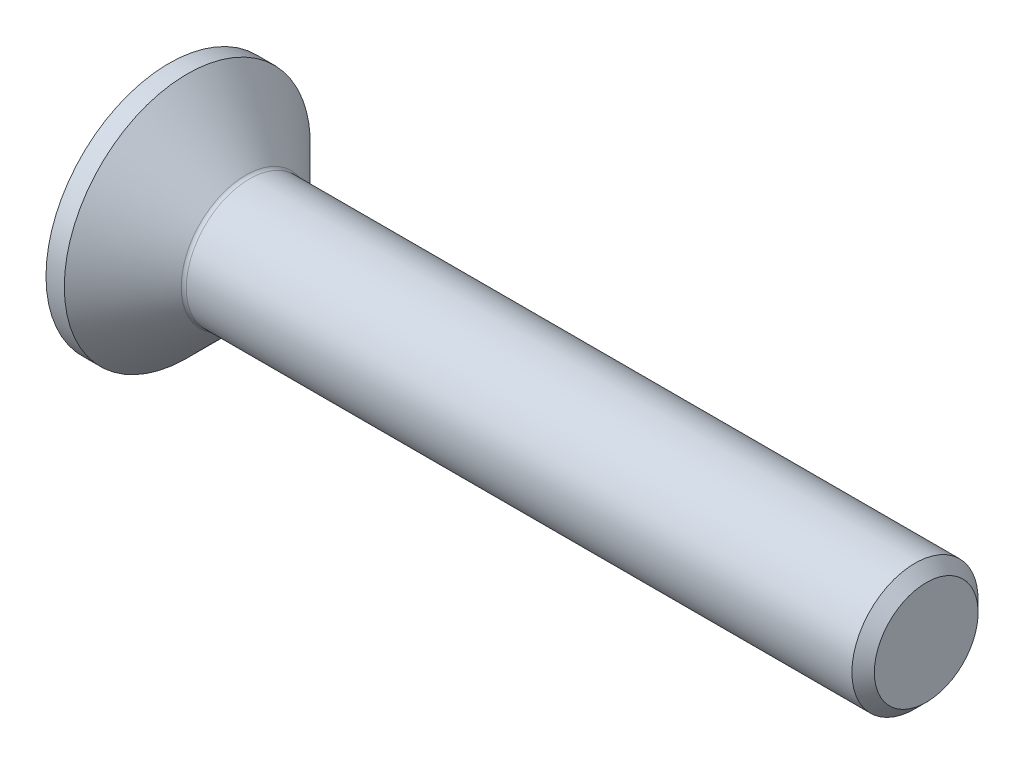
ISO-10303-21;
HEADER;
FILE_DESCRIPTION(('STEP AP214'),'2;1');
FILE_NAME('part.step','',(''),(''),'','','');
FILE_SCHEMA(('AUTOMOTIVE_DESIGN { 1 0 10303 214 1 1 1 1 }'));
ENDSEC;
DATA;
#1=APPLICATION_CONTEXT('core data for automotive mechanical design processes');
#2=APPLICATION_PROTOCOL_DEFINITION('international standard','automotive_design',2000,#1);
#3=PRODUCT_CONTEXT('',#1,'mechanical');
#4=PRODUCT('Part','Part','',(#3));
#5=PRODUCT_RELATED_PRODUCT_CATEGORY('part','',(#4));
#6=PRODUCT_DEFINITION_FORMATION('','',#4);
#7=PRODUCT_DEFINITION_CONTEXT('part definition',#1,'design');
#8=PRODUCT_DEFINITION('design','',#6,#7);
#9=PRODUCT_DEFINITION_SHAPE('','',#8);
#10=(LENGTH_UNIT() NAMED_UNIT(*) SI_UNIT(.MILLI.,.METRE.));
#11=(NAMED_UNIT(*) PLANE_ANGLE_UNIT() SI_UNIT($,.RADIAN.));
#12=(NAMED_UNIT(*) SI_UNIT($,.STERADIAN.) SOLID_ANGLE_UNIT());
#13=UNCERTAINTY_MEASURE_WITH_UNIT(LENGTH_MEASURE(1.E-05),#10,'distance_accuracy_value','');
#14=(GEOMETRIC_REPRESENTATION_CONTEXT(3) GLOBAL_UNCERTAINTY_ASSIGNED_CONTEXT((#13)) GLOBAL_UNIT_ASSIGNED_CONTEXT((#10,
#11,#12)) REPRESENTATION_CONTEXT('',''));
#15=CARTESIAN_POINT('',(0.,0.,0.));
#16=DIRECTION('',(0.,0.,1.));
#17=DIRECTION('',(1.,0.,0.));
#18=AXIS2_PLACEMENT_3D('',#15,#16,#17);
#19=CARTESIAN_POINT('',(0.,0.,0.));
#20=DIRECTION('',(-1.,0.,0.));
#21=DIRECTION('',(0.,0.,1.));
#22=AXIS2_PLACEMENT_3D('',#19,#20,#21);
#23=PLANE('',#22);
#24=CARTESIAN_POINT('',(0.,0.,0.));
#25=DIRECTION('',(-1.,0.,0.));
#26=DIRECTION('',(0.,0.,1.));
#27=AXIS2_PLACEMENT_3D('',#24,#25,#26);
#28=CIRCLE('',#27,4.875);
#29=CARTESIAN_POINT('',(0.,0.,4.875));
#30=VERTEX_POINT('',#29);
#31=EDGE_CURVE('E153',#30,#30,#28,.T.);
#32=ORIENTED_EDGE('',*,*,#31,.T.);
#33=EDGE_LOOP('',(#32));
#34=FACE_BOUND('',#33,.T.);
#35=DIRECTION('',(0.,-0.5,-0.866025403784438));
#36=VECTOR('',#35,1.);
#37=CARTESIAN_POINT('',(0.,-0.866025403784439,1.5));
#38=LINE('',#37,#36);
#39=CARTESIAN_POINT('',(0.,-0.866025403784439,1.5));
#40=VERTEX_POINT('',#39);
#41=CARTESIAN_POINT('',(0.,-1.73205080756888,0.));
#42=VERTEX_POINT('',#41);
#43=EDGE_CURVE('E119',#40,#42,#38,.T.);
#44=ORIENTED_EDGE('',*,*,#43,.T.);
#45=DIRECTION('',(0.,0.5,-0.866025403784439));
#46=VECTOR('',#45,1.);
#47=CARTESIAN_POINT('',(0.,-1.73205080756888,0.));
#48=LINE('',#47,#46);
#49=CARTESIAN_POINT('',(0.,-0.866025403784439,-1.5));
#50=VERTEX_POINT('',#49);
#51=EDGE_CURVE('E50',#42,#50,#48,.T.);
#52=ORIENTED_EDGE('',*,*,#51,.T.);
#53=DIRECTION('',(0.,1.,0.));
#54=VECTOR('',#53,1.);
#55=CARTESIAN_POINT('',(0.,-0.866025403784439,-1.5));
#56=LINE('',#55,#54);
#57=CARTESIAN_POINT('',(0.,0.866025403784438,-1.5));
#58=VERTEX_POINT('',#57);
#59=EDGE_CURVE('E130',#50,#58,#56,.T.);
#60=ORIENTED_EDGE('',*,*,#59,.T.);
#61=DIRECTION('',(0.,0.5,0.866025403784438));
#62=VECTOR('',#61,1.);
#63=CARTESIAN_POINT('',(0.,0.866025403784438,-1.5));
#64=LINE('',#63,#62);
#65=CARTESIAN_POINT('',(0.,1.73205080756888,0.));
#66=VERTEX_POINT('',#65);
#67=EDGE_CURVE('E254',#58,#66,#64,.T.);
#68=ORIENTED_EDGE('',*,*,#67,.T.);
#69=DIRECTION('',(0.,-0.5,0.866025403784438));
#70=VECTOR('',#69,1.);
#71=CARTESIAN_POINT('',(0.,1.73205080756888,0.));
#72=LINE('',#71,#70);
#73=CARTESIAN_POINT('',(0.,0.866025403784438,1.5));
#74=VERTEX_POINT('',#73);
#75=EDGE_CURVE('E257',#66,#74,#72,.T.);
#76=ORIENTED_EDGE('',*,*,#75,.T.);
#77=DIRECTION('',(0.,-1.,0.));
#78=VECTOR('',#77,1.);
#79=CARTESIAN_POINT('',(0.,0.866025403784438,1.5));
#80=LINE('',#79,#78);
#81=EDGE_CURVE('E260',#74,#40,#80,.T.);
#82=ORIENTED_EDGE('',*,*,#81,.T.);
#83=EDGE_LOOP('',(#44,#52,#60,#68,#76,#82));
#84=FACE_BOUND('',#83,.T.);
#85=ADVANCED_FACE('F35',(#34,#84),#23,.T.);
#86=CARTESIAN_POINT('',(0.,0.,0.));
#87=DIRECTION('',(-1.,0.,0.));
#88=DIRECTION('',(0.,0.,1.));
#89=AXIS2_PLACEMENT_3D('',#86,#87,#88);
#90=CYLINDRICAL_SURFACE('',#89,4.875);
#91=CARTESIAN_POINT('',(0.725000000000011,0.,0.));
#92=DIRECTION('',(-1.,0.,0.));
#93=DIRECTION('',(0.,0.,1.));
#94=AXIS2_PLACEMENT_3D('',#91,#92,#93);
#95=CIRCLE('',#94,4.875);
#96=CARTESIAN_POINT('',(0.725000000000011,0.,4.875));
#97=VERTEX_POINT('',#96);
#98=EDGE_CURVE('E150',#97,#97,#95,.T.);
#99=ORIENTED_EDGE('',*,*,#98,.T.);
#100=EDGE_LOOP('',(#99));
#101=FACE_BOUND('',#100,.T.);
#102=ORIENTED_EDGE('',*,*,#31,.F.);
#103=EDGE_LOOP('',(#102));
#104=FACE_BOUND('',#103,.T.);
#105=ADVANCED_FACE('F174',(#101,#104),#90,.T.);
#106=CARTESIAN_POINT('',(0.725000000000011,0.,0.));
#107=DIRECTION('',(-1.,0.,0.));
#108=DIRECTION('',(0.,0.,1.));
#109=AXIS2_PLACEMENT_3D('',#106,#107,#108);
#110=CONICAL_SURFACE('',#109,4.875,0.78539816339745);
#111=CARTESIAN_POINT('',(3.04142135623733,0.,0.));
#112=DIRECTION('',(-1.,0.,0.));
#113=DIRECTION('',(0.,0.,1.));
#114=AXIS2_PLACEMENT_3D('',#111,#112,#113);
#115=CIRCLE('',#114,2.55857864376267);
#116=CARTESIAN_POINT('',(3.04142135623733,0.,2.55857864376267));
#117=VERTEX_POINT('',#116);
#118=EDGE_CURVE('E43',#117,#117,#115,.T.);
#119=ORIENTED_EDGE('',*,*,#118,.T.);
#120=EDGE_LOOP('',(#119));
#121=FACE_BOUND('',#120,.T.);
#122=ORIENTED_EDGE('',*,*,#98,.F.);
#123=EDGE_LOOP('',(#122));
#124=FACE_BOUND('',#123,.T.);
#125=ADVANCED_FACE('F158',(#121,#124),#110,.T.);
#126=CARTESIAN_POINT('',(0.,0.,0.));
#127=DIRECTION('',(-1.,0.,0.));
#128=DIRECTION('',(0.,0.,1.));
#129=AXIS2_PLACEMENT_3D('',#126,#127,#128);
#130=CYLINDRICAL_SURFACE('',#129,2.49999999999998);
#131=CARTESIAN_POINT('',(3.18284271247464,0.,0.));
#132=DIRECTION('',(-1.,0.,0.));
#133=DIRECTION('',(0.,0.,1.));
#134=AXIS2_PLACEMENT_3D('',#131,#132,#133);
#135=CIRCLE('',#134,2.49999999999998);
#136=CARTESIAN_POINT('',(3.18284271247464,0.,2.49999999999998));
#137=VERTEX_POINT('',#136);
#138=EDGE_CURVE('E11',#137,#137,#135,.F.);
#139=ORIENTED_EDGE('',*,*,#138,.T.);
#140=EDGE_LOOP('',(#139));
#141=FACE_BOUND('',#140,.T.);
#142=CARTESIAN_POINT('',(29.555,0.,0.));
#143=DIRECTION('',(-1.,0.,0.));
#144=DIRECTION('',(0.,0.,1.));
#145=AXIS2_PLACEMENT_3D('',#142,#143,#144);
#146=CIRCLE('',#145,2.49999999999996);
#147=CARTESIAN_POINT('',(29.555,0.,2.49999999999996));
#148=VERTEX_POINT('',#147);
#149=EDGE_CURVE('E147',#148,#148,#146,.T.);
#150=ORIENTED_EDGE('',*,*,#149,.T.);
#151=EDGE_LOOP('',(#150));
#152=FACE_BOUND('',#151,.T.);
#153=ADVANCED_FACE('F185',(#141,#152),#130,.T.);
#154=CARTESIAN_POINT('',(30.,0.,0.));
#155=DIRECTION('',(-1.,0.,0.));
#156=DIRECTION('',(0.,0.,1.));
#157=AXIS2_PLACEMENT_3D('',#154,#155,#156);
#158=CONICAL_SURFACE('',#157,2.055,0.785398163397382);
#159=ORIENTED_EDGE('',*,*,#149,.F.);
#160=EDGE_LOOP('',(#159));
#161=FACE_BOUND('',#160,.T.);
#162=CARTESIAN_POINT('',(30.,0.,0.));
#163=DIRECTION('',(-1.,0.,0.));
#164=DIRECTION('',(0.,0.,1.));
#165=AXIS2_PLACEMENT_3D('',#162,#163,#164);
#166=CIRCLE('',#165,2.055);
#167=CARTESIAN_POINT('',(30.,0.,2.055));
#168=VERTEX_POINT('',#167);
#169=EDGE_CURVE('E143',#168,#168,#166,.T.);
#170=ORIENTED_EDGE('',*,*,#169,.T.);
#171=EDGE_LOOP('',(#170));
#172=FACE_BOUND('',#171,.T.);
#173=ADVANCED_FACE('F169',(#161,#172),#158,.T.);
#174=CARTESIAN_POINT('',(30.,2.055,0.));
#175=DIRECTION('',(1.,0.,0.));
#176=DIRECTION('',(0.,0.,-1.));
#177=AXIS2_PLACEMENT_3D('',#174,#175,#176);
#178=PLANE('',#177);
#179=ORIENTED_EDGE('',*,*,#169,.F.);
#180=EDGE_LOOP('',(#179));
#181=FACE_BOUND('',#180,.T.);
#182=ADVANCED_FACE('F162',(#181),#178,.T.);
#183=CARTESIAN_POINT('',(3.18284271247464,0.,0.));
#184=DIRECTION('',(-1.,0.,0.));
#185=DIRECTION('',(0.,0.,1.));
#186=AXIS2_PLACEMENT_3D('',#183,#184,#185);
#187=TOROIDAL_SURFACE('',#186,2.69999999999998,0.2);
#188=ORIENTED_EDGE('',*,*,#138,.F.);
#189=EDGE_LOOP('',(#188));
#190=FACE_BOUND('',#189,.T.);
#191=ORIENTED_EDGE('',*,*,#118,.F.);
#192=EDGE_LOOP('',(#191));
#193=FACE_BOUND('',#192,.T.);
#194=ADVANCED_FACE('F37',(#190,#193),#187,.F.);
#195=CARTESIAN_POINT('',(1.9,-1.73205080756888,0.));
#196=DIRECTION('',(0.,0.866025403784438,0.5));
#197=DIRECTION('',(0.,-0.5,0.866025403784439));
#198=AXIS2_PLACEMENT_3D('',#195,#196,#197);
#199=PLANE('',#198);
#200=ORIENTED_EDGE('',*,*,#51,.F.);
#201=DIRECTION('',(-1.,0.,0.));
#202=VECTOR('',#201,1.);
#203=CARTESIAN_POINT('',(1.9,-1.73205080756888,0.));
#204=LINE('',#203,#202);
#205=CARTESIAN_POINT('',(1.9,-1.73205080756888,0.));
#206=VERTEX_POINT('',#205);
#207=EDGE_CURVE('E251',#206,#42,#204,.T.);
#208=ORIENTED_EDGE('',*,*,#207,.F.);
#209=DIRECTION('',(0.,0.5,-0.866025403784439));
#210=VECTOR('',#209,1.);
#211=CARTESIAN_POINT('',(1.9,-1.73205080756888,0.));
#212=LINE('',#211,#210);
#213=CARTESIAN_POINT('',(1.9,-1.29903810567666,-0.750000000000001));
#214=VERTEX_POINT('',#213);
#215=EDGE_CURVE('E115',#206,#214,#212,.T.);
#216=ORIENTED_EDGE('',*,*,#215,.T.);
#217=CARTESIAN_POINT('',(1.9,-0.866025403784439,-1.5));
#218=VERTEX_POINT('',#217);
#219=EDGE_CURVE('E111',#214,#218,#212,.T.);
#220=ORIENTED_EDGE('',*,*,#219,.T.);
#221=DIRECTION('',(-1.,0.,0.));
#222=VECTOR('',#221,1.);
#223=CARTESIAN_POINT('',(1.9,-0.866025403784439,-1.5));
#224=LINE('',#223,#222);
#225=EDGE_CURVE('E113',#218,#50,#224,.T.);
#226=ORIENTED_EDGE('',*,*,#225,.T.);
#227=EDGE_LOOP('',(#200,#208,#216,#220,#226));
#228=FACE_BOUND('',#227,.T.);
#229=ADVANCED_FACE('F112',(#228),#199,.T.);
#230=CARTESIAN_POINT('',(1.9,-0.866025403784439,-1.5));
#231=DIRECTION('',(0.,0.,1.));
#232=DIRECTION('',(0.,-1.,0.));
#233=AXIS2_PLACEMENT_3D('',#230,#231,#232);
#234=PLANE('',#233);
#235=ORIENTED_EDGE('',*,*,#59,.F.);
#236=ORIENTED_EDGE('',*,*,#225,.F.);
#237=DIRECTION('',(0.,1.,0.));
#238=VECTOR('',#237,1.);
#239=CARTESIAN_POINT('',(1.9,-0.866025403784439,-1.5));
#240=LINE('',#239,#238);
#241=CARTESIAN_POINT('',(1.9,0.,-1.5));
#242=VERTEX_POINT('',#241);
#243=EDGE_CURVE('E58',#218,#242,#240,.T.);
#244=ORIENTED_EDGE('',*,*,#243,.T.);
#245=CARTESIAN_POINT('',(1.9,0.866025403784438,-1.5));
#246=VERTEX_POINT('',#245);
#247=EDGE_CURVE('E125',#242,#246,#240,.T.);
#248=ORIENTED_EDGE('',*,*,#247,.T.);
#249=DIRECTION('',(-1.,0.,0.));
#250=VECTOR('',#249,1.);
#251=CARTESIAN_POINT('',(1.9,0.866025403784438,-1.5));
#252=LINE('',#251,#250);
#253=EDGE_CURVE('E132',#246,#58,#252,.T.);
#254=ORIENTED_EDGE('',*,*,#253,.T.);
#255=EDGE_LOOP('',(#235,#236,#244,#248,#254));
#256=FACE_BOUND('',#255,.T.);
#257=ADVANCED_FACE('F127',(#256),#234,.T.);
#258=CARTESIAN_POINT('',(1.9,0.866025403784438,-1.5));
#259=DIRECTION('',(0.,-0.866025403784439,0.5));
#260=DIRECTION('',(0.,-0.5,-0.866025403784439));
#261=AXIS2_PLACEMENT_3D('',#258,#259,#260);
#262=PLANE('',#261);
#263=ORIENTED_EDGE('',*,*,#67,.F.);
#264=ORIENTED_EDGE('',*,*,#253,.F.);
#265=DIRECTION('',(0.,0.5,0.866025403784438));
#266=VECTOR('',#265,1.);
#267=CARTESIAN_POINT('',(1.9,0.866025403784438,-1.5));
#268=LINE('',#267,#266);
#269=CARTESIAN_POINT('',(1.9,1.29903810567666,-0.75));
#270=VERTEX_POINT('',#269);
#271=EDGE_CURVE('E232',#246,#270,#268,.T.);
#272=ORIENTED_EDGE('',*,*,#271,.T.);
#273=CARTESIAN_POINT('',(1.9,1.73205080756888,0.));
#274=VERTEX_POINT('',#273);
#275=EDGE_CURVE('E124',#270,#274,#268,.T.);
#276=ORIENTED_EDGE('',*,*,#275,.T.);
#277=DIRECTION('',(-1.,0.,0.));
#278=VECTOR('',#277,1.);
#279=CARTESIAN_POINT('',(1.9,1.73205080756888,0.));
#280=LINE('',#279,#278);
#281=EDGE_CURVE('E138',#274,#66,#280,.T.);
#282=ORIENTED_EDGE('',*,*,#281,.T.);
#283=EDGE_LOOP('',(#263,#264,#272,#276,#282));
#284=FACE_BOUND('',#283,.T.);
#285=ADVANCED_FACE('F199',(#284),#262,.T.);
#286=CARTESIAN_POINT('',(1.9,1.73205080756888,0.));
#287=DIRECTION('',(0.,-0.866025403784439,-0.5));
#288=DIRECTION('',(0.,0.5,-0.866025403784439));
#289=AXIS2_PLACEMENT_3D('',#286,#287,#288);
#290=PLANE('',#289);
#291=ORIENTED_EDGE('',*,*,#75,.F.);
#292=ORIENTED_EDGE('',*,*,#281,.F.);
#293=DIRECTION('',(0.,-0.5,0.866025403784438));
#294=VECTOR('',#293,1.);
#295=CARTESIAN_POINT('',(1.9,1.73205080756888,0.));
#296=LINE('',#295,#294);
#297=CARTESIAN_POINT('',(1.9,1.29903810567666,0.75));
#298=VERTEX_POINT('',#297);
#299=EDGE_CURVE('E239',#274,#298,#296,.T.);
#300=ORIENTED_EDGE('',*,*,#299,.T.);
#301=CARTESIAN_POINT('',(1.9,0.866025403784438,1.5));
#302=VERTEX_POINT('',#301);
#303=EDGE_CURVE('E237',#298,#302,#296,.T.);
#304=ORIENTED_EDGE('',*,*,#303,.T.);
#305=DIRECTION('',(-1.,0.,0.));
#306=VECTOR('',#305,1.);
#307=CARTESIAN_POINT('',(1.9,0.866025403784438,1.5));
#308=LINE('',#307,#306);
#309=EDGE_CURVE('E269',#302,#74,#308,.T.);
#310=ORIENTED_EDGE('',*,*,#309,.T.);
#311=EDGE_LOOP('',(#291,#292,#300,#304,#310));
#312=FACE_BOUND('',#311,.T.);
#313=ADVANCED_FACE('F202',(#312),#290,.T.);
#314=CARTESIAN_POINT('',(1.9,0.866025403784438,1.5));
#315=DIRECTION('',(0.,0.,-1.));
#316=DIRECTION('',(0.,1.,0.));
#317=AXIS2_PLACEMENT_3D('',#314,#315,#316);
#318=PLANE('',#317);
#319=ORIENTED_EDGE('',*,*,#81,.F.);
#320=ORIENTED_EDGE('',*,*,#309,.F.);
#321=DIRECTION('',(0.,-1.,0.));
#322=VECTOR('',#321,1.);
#323=CARTESIAN_POINT('',(1.9,0.866025403784438,1.5));
#324=LINE('',#323,#322);
#325=CARTESIAN_POINT('',(1.9,0.,1.5));
#326=VERTEX_POINT('',#325);
#327=EDGE_CURVE('E244',#302,#326,#324,.T.);
#328=ORIENTED_EDGE('',*,*,#327,.T.);
#329=CARTESIAN_POINT('',(1.9,-0.866025403784439,1.5));
#330=VERTEX_POINT('',#329);
#331=EDGE_CURVE('E243',#326,#330,#324,.T.);
#332=ORIENTED_EDGE('',*,*,#331,.T.);
#333=DIRECTION('',(-1.,0.,0.));
#334=VECTOR('',#333,1.);
#335=CARTESIAN_POINT('',(1.9,-0.866025403784439,1.5));
#336=LINE('',#335,#334);
#337=EDGE_CURVE('E266',#330,#40,#336,.T.);
#338=ORIENTED_EDGE('',*,*,#337,.T.);
#339=EDGE_LOOP('',(#319,#320,#328,#332,#338));
#340=FACE_BOUND('',#339,.T.);
#341=ADVANCED_FACE('F206',(#340),#318,.T.);
#342=CARTESIAN_POINT('',(1.9,-0.866025403784439,1.5));
#343=DIRECTION('',(0.,0.866025403784439,-0.5));
#344=DIRECTION('',(0.,0.5,0.866025403784439));
#345=AXIS2_PLACEMENT_3D('',#342,#343,#344);
#346=PLANE('',#345);
#347=ORIENTED_EDGE('',*,*,#43,.F.);
#348=ORIENTED_EDGE('',*,*,#337,.F.);
#349=DIRECTION('',(0.,-0.5,-0.866025403784438));
#350=VECTOR('',#349,1.);
#351=CARTESIAN_POINT('',(1.9,-0.866025403784439,1.5));
#352=LINE('',#351,#350);
#353=CARTESIAN_POINT('',(1.9,-1.29903810567666,0.75));
#354=VERTEX_POINT('',#353);
#355=EDGE_CURVE('E248',#330,#354,#352,.T.);
#356=ORIENTED_EDGE('',*,*,#355,.T.);
#357=EDGE_CURVE('E247',#354,#206,#352,.T.);
#358=ORIENTED_EDGE('',*,*,#357,.T.);
#359=ORIENTED_EDGE('',*,*,#207,.T.);
#360=EDGE_LOOP('',(#347,#348,#356,#358,#359));
#361=FACE_BOUND('',#360,.T.);
#362=ADVANCED_FACE('F210',(#361),#346,.T.);
#363=CARTESIAN_POINT('',(1.9,0.,-3.));
#364=DIRECTION('',(1.,0.,0.));
#365=DIRECTION('',(0.,0.,-1.));
#366=AXIS2_PLACEMENT_3D('',#363,#364,#365);
#367=PLANE('',#366);
#368=ORIENTED_EDGE('',*,*,#243,.F.);
#369=ORIENTED_EDGE('',*,*,#219,.F.);
#370=CARTESIAN_POINT('',(1.9,0.,0.));
#371=DIRECTION('',(-1.,0.,0.));
#372=DIRECTION('',(0.,0.,1.));
#373=AXIS2_PLACEMENT_3D('',#370,#371,#372);
#374=CIRCLE('',#373,1.5);
#375=EDGE_CURVE('E122',#242,#214,#374,.T.);
#376=ORIENTED_EDGE('',*,*,#375,.F.);
#377=EDGE_LOOP('',(#368,#369,#376));
#378=FACE_BOUND('',#377,.T.);
#379=ADVANCED_FACE('F121',(#378),#367,.F.);
#380=ORIENTED_EDGE('',*,*,#215,.F.);
#381=ORIENTED_EDGE('',*,*,#357,.F.);
#382=EDGE_CURVE('E135',#214,#354,#374,.T.);
#383=ORIENTED_EDGE('',*,*,#382,.F.);
#384=EDGE_LOOP('',(#380,#381,#383));
#385=FACE_BOUND('',#384,.T.);
#386=ADVANCED_FACE('F216',(#385),#367,.F.);
#387=ORIENTED_EDGE('',*,*,#355,.F.);
#388=ORIENTED_EDGE('',*,*,#331,.F.);
#389=EDGE_CURVE('E131',#354,#326,#374,.T.);
#390=ORIENTED_EDGE('',*,*,#389,.F.);
#391=EDGE_LOOP('',(#387,#388,#390));
#392=FACE_BOUND('',#391,.T.);
#393=ADVANCED_FACE('F220',(#392),#367,.F.);
#394=ORIENTED_EDGE('',*,*,#327,.F.);
#395=ORIENTED_EDGE('',*,*,#303,.F.);
#396=EDGE_CURVE('E137',#326,#298,#374,.T.);
#397=ORIENTED_EDGE('',*,*,#396,.F.);
#398=EDGE_LOOP('',(#394,#395,#397));
#399=FACE_BOUND('',#398,.T.);
#400=ADVANCED_FACE('F228',(#399),#367,.F.);
#401=ORIENTED_EDGE('',*,*,#299,.F.);
#402=ORIENTED_EDGE('',*,*,#275,.F.);
#403=EDGE_CURVE('E144',#298,#270,#374,.T.);
#404=ORIENTED_EDGE('',*,*,#403,.F.);
#405=EDGE_LOOP('',(#401,#402,#404));
#406=FACE_BOUND('',#405,.T.);
#407=ADVANCED_FACE('F223',(#406),#367,.F.);
#408=ORIENTED_EDGE('',*,*,#271,.F.);
#409=ORIENTED_EDGE('',*,*,#247,.F.);
#410=EDGE_CURVE('E233',#270,#242,#374,.T.);
#411=ORIENTED_EDGE('',*,*,#410,.F.);
#412=EDGE_LOOP('',(#408,#409,#411));
#413=FACE_BOUND('',#412,.T.);
#414=ADVANCED_FACE('F194',(#413),#367,.F.);
#415=CARTESIAN_POINT('',(1.9,0.,0.));
#416=DIRECTION('',(-1.,0.,0.));
#417=DIRECTION('',(0.,0.,1.));
#418=AXIS2_PLACEMENT_3D('',#415,#416,#417);
#419=CONICAL_SURFACE('',#418,1.5,1.04719755119659);
#420=CARTESIAN_POINT('',(2.76602540378445,0.,0.));
#421=VERTEX_POINT('',#420);
#422=VERTEX_LOOP('',#421);
#423=FACE_BOUND('',#422,.T.);
#424=ORIENTED_EDGE('',*,*,#396,.T.);
#425=ORIENTED_EDGE('',*,*,#403,.T.);
#426=ORIENTED_EDGE('',*,*,#410,.T.);
#427=ORIENTED_EDGE('',*,*,#375,.T.);
#428=ORIENTED_EDGE('',*,*,#382,.T.);
#429=ORIENTED_EDGE('',*,*,#389,.T.);
#430=EDGE_LOOP('',(#424,#425,#426,#427,#428,#429));
#431=FACE_BOUND('',#430,.T.);
#432=ADVANCED_FACE('F192',(#423,#431),#419,.F.);
#433=CLOSED_SHELL('',(#85,#105,#125,#153,#173,#182,#194,#229,#257,#285,#313,#341,#362,#379,#386,
#393,#400,#407,#414,#432));
#434=MANIFOLD_SOLID_BREP('B2',#433);
#435=ADVANCED_BREP_SHAPE_REPRESENTATION('',(#18,#434),#14);
#436=SHAPE_DEFINITION_REPRESENTATION(#9,#435);
ENDSEC;
END-ISO-10303-21;
